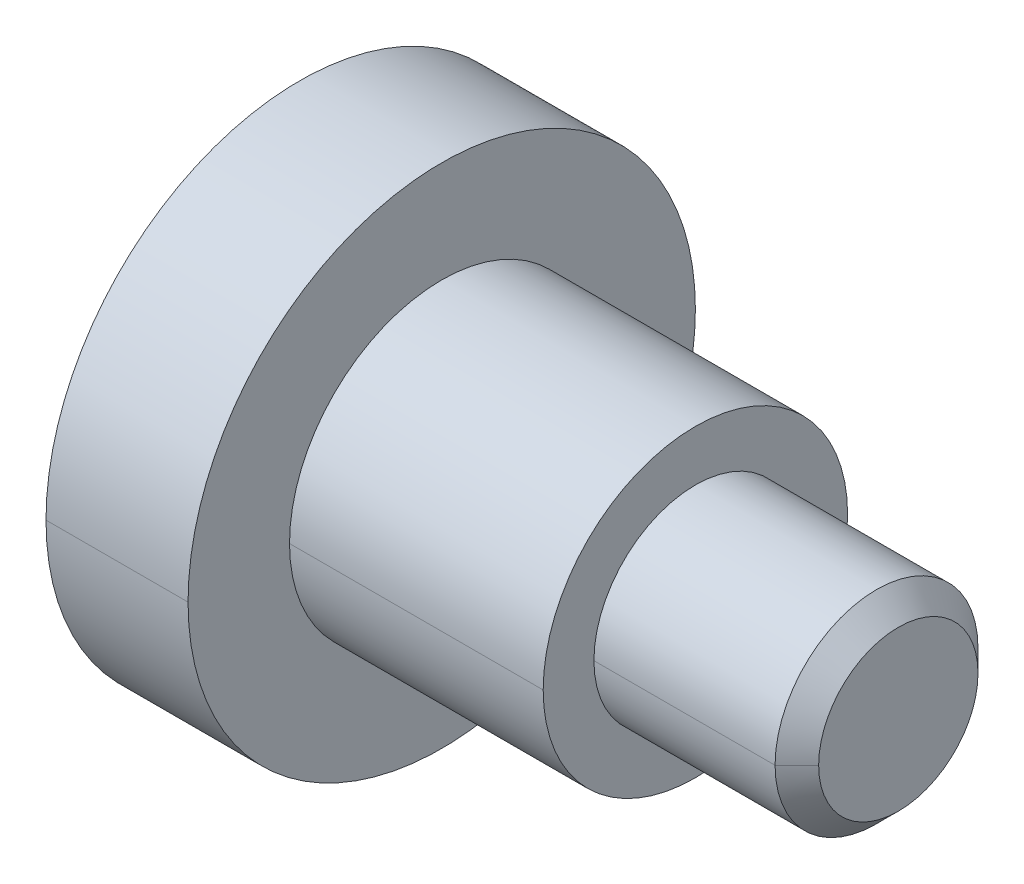
ISO-10303-21;
HEADER;
FILE_DESCRIPTION(('STEP AP214'),'2;1');
FILE_NAME('part.step','',(''),(''),'','','');
FILE_SCHEMA(('AUTOMOTIVE_DESIGN { 1 0 10303 214 1 1 1 1 }'));
ENDSEC;
DATA;
#1=APPLICATION_CONTEXT('core data for automotive mechanical design processes');
#2=APPLICATION_PROTOCOL_DEFINITION('international standard','automotive_design',2000,#1);
#3=PRODUCT_CONTEXT('',#1,'mechanical');
#4=PRODUCT('Part','Part','',(#3));
#5=PRODUCT_RELATED_PRODUCT_CATEGORY('part','',(#4));
#6=PRODUCT_DEFINITION_FORMATION('','',#4);
#7=PRODUCT_DEFINITION_CONTEXT('part definition',#1,'design');
#8=PRODUCT_DEFINITION('design','',#6,#7);
#9=PRODUCT_DEFINITION_SHAPE('','',#8);
#10=(LENGTH_UNIT() NAMED_UNIT(*) SI_UNIT(.MILLI.,.METRE.));
#11=(NAMED_UNIT(*) PLANE_ANGLE_UNIT() SI_UNIT($,.RADIAN.));
#12=(NAMED_UNIT(*) SI_UNIT($,.STERADIAN.) SOLID_ANGLE_UNIT());
#13=UNCERTAINTY_MEASURE_WITH_UNIT(LENGTH_MEASURE(1.E-05),#10,'distance_accuracy_value','');
#14=(GEOMETRIC_REPRESENTATION_CONTEXT(3) GLOBAL_UNCERTAINTY_ASSIGNED_CONTEXT((#13)) GLOBAL_UNIT_ASSIGNED_CONTEXT((#10,
#11,#12)) REPRESENTATION_CONTEXT('',''));
#15=CARTESIAN_POINT('',(0.,0.,0.));
#16=DIRECTION('',(0.,0.,1.));
#17=DIRECTION('',(1.,0.,0.));
#18=AXIS2_PLACEMENT_3D('',#15,#16,#17);
#19=CARTESIAN_POINT('',(4.,1.5705,0.));
#20=DIRECTION('',(-1.,0.,0.));
#21=DIRECTION('',(0.,0.,1.));
#22=AXIS2_PLACEMENT_3D('',#19,#20,#21);
#23=PLANE('',#22);
#24=CARTESIAN_POINT('',(4.,0.,0.));
#25=DIRECTION('',(1.,0.,0.));
#26=DIRECTION('',(0.,0.,-1.));
#27=AXIS2_PLACEMENT_3D('',#24,#25,#26);
#28=CIRCLE('',#27,1.5705);
#29=CARTESIAN_POINT('',(4.,0.,1.5705));
#30=VERTEX_POINT('',#29);
#31=CARTESIAN_POINT('',(4.,0.,-1.5705));
#32=VERTEX_POINT('',#31);
#33=EDGE_CURVE('E9',#30,#32,#28,.T.);
#34=ORIENTED_EDGE('',*,*,#33,.T.);
#35=CARTESIAN_POINT('',(4.,0.,0.));
#36=DIRECTION('',(1.,0.,0.));
#37=DIRECTION('',(0.,0.,-1.));
#38=AXIS2_PLACEMENT_3D('',#35,#36,#37);
#39=CIRCLE('',#38,1.5705);
#40=EDGE_CURVE('E175',#32,#30,#39,.T.);
#41=ORIENTED_EDGE('',*,*,#40,.T.);
#42=EDGE_LOOP('',(#34,#41));
#43=FACE_BOUND('',#42,.T.);
#44=ADVANCED_FACE('F15',(#43),#23,.F.);
#45=CARTESIAN_POINT('',(3.5705,0.,0.));
#46=DIRECTION('',(-1.,0.,0.));
#47=DIRECTION('',(0.,0.,1.));
#48=AXIS2_PLACEMENT_3D('',#45,#46,#47);
#49=CONICAL_SURFACE('',#48,2.,0.785398163397448);
#50=DIRECTION('',(-0.707106781186548,0.,-0.707106781186547));
#51=VECTOR('',#50,1.);
#52=CARTESIAN_POINT('',(3.5705,0.,-2.));
#53=LINE('',#52,#51);
#54=CARTESIAN_POINT('',(3.5705,0.,-2.));
#55=VERTEX_POINT('',#54);
#56=EDGE_CURVE('E180',#32,#55,#53,.T.);
#57=ORIENTED_EDGE('',*,*,#56,.F.);
#58=ORIENTED_EDGE('',*,*,#33,.F.);
#59=DIRECTION('',(-0.707106781186548,0.,0.707106781186547));
#60=VECTOR('',#59,1.);
#61=CARTESIAN_POINT('',(3.5705,0.,2.));
#62=LINE('',#61,#60);
#63=CARTESIAN_POINT('',(3.5705,0.,2.));
#64=VERTEX_POINT('',#63);
#65=EDGE_CURVE('E189',#30,#64,#62,.T.);
#66=ORIENTED_EDGE('',*,*,#65,.T.);
#67=CARTESIAN_POINT('',(3.5705,0.,0.));
#68=DIRECTION('',(1.,0.,0.));
#69=DIRECTION('',(0.,0.,-1.));
#70=AXIS2_PLACEMENT_3D('',#67,#68,#69);
#71=CIRCLE('',#70,2.);
#72=EDGE_CURVE('E24',#64,#55,#71,.T.);
#73=ORIENTED_EDGE('',*,*,#72,.T.);
#74=EDGE_LOOP('',(#57,#58,#66,#73));
#75=FACE_BOUND('',#74,.T.);
#76=ADVANCED_FACE('F181',(#75),#49,.T.);
#77=CARTESIAN_POINT('',(4.,0.,0.));
#78=DIRECTION('',(1.,0.,0.));
#79=DIRECTION('',(0.,0.,-1.));
#80=AXIS2_PLACEMENT_3D('',#77,#78,#79);
#81=CYLINDRICAL_SURFACE('',#80,2.);
#82=DIRECTION('',(1.,0.,0.));
#83=VECTOR('',#82,1.);
#84=CARTESIAN_POINT('',(4.,0.,2.));
#85=LINE('',#84,#83);
#86=CARTESIAN_POINT('',(0.,0.,2.));
#87=VERTEX_POINT('',#86);
#88=EDGE_CURVE('E214',#87,#64,#85,.T.);
#89=ORIENTED_EDGE('',*,*,#88,.F.);
#90=CARTESIAN_POINT('',(0.,0.,0.));
#91=DIRECTION('',(1.,0.,0.));
#92=DIRECTION('',(0.,0.,-1.));
#93=AXIS2_PLACEMENT_3D('',#90,#91,#92);
#94=CIRCLE('',#93,2.);
#95=CARTESIAN_POINT('',(0.,0.,-2.));
#96=VERTEX_POINT('',#95);
#97=EDGE_CURVE('E18',#87,#96,#94,.T.);
#98=ORIENTED_EDGE('',*,*,#97,.T.);
#99=DIRECTION('',(1.,0.,0.));
#100=VECTOR('',#99,1.);
#101=CARTESIAN_POINT('',(4.,0.,-2.));
#102=LINE('',#101,#100);
#103=EDGE_CURVE('E218',#96,#55,#102,.T.);
#104=ORIENTED_EDGE('',*,*,#103,.T.);
#105=ORIENTED_EDGE('',*,*,#72,.F.);
#106=EDGE_LOOP('',(#89,#98,#104,#105));
#107=FACE_BOUND('',#106,.T.);
#108=ADVANCED_FACE('F378',(#107),#81,.T.);
#109=CARTESIAN_POINT('',(0.,3.,0.));
#110=DIRECTION('',(-1.,0.,0.));
#111=DIRECTION('',(0.,0.,1.));
#112=AXIS2_PLACEMENT_3D('',#109,#110,#111);
#113=PLANE('',#112);
#114=CARTESIAN_POINT('',(0.,0.,0.));
#115=DIRECTION('',(1.,0.,0.));
#116=DIRECTION('',(0.,0.,-1.));
#117=AXIS2_PLACEMENT_3D('',#114,#115,#116);
#118=CIRCLE('',#117,2.);
#119=EDGE_CURVE('E219',#96,#87,#118,.T.);
#120=ORIENTED_EDGE('',*,*,#119,.F.);
#121=ORIENTED_EDGE('',*,*,#97,.F.);
#122=EDGE_LOOP('',(#120,#121));
#123=FACE_BOUND('',#122,.T.);
#124=CARTESIAN_POINT('',(0.,0.,0.));
#125=DIRECTION('',(1.,0.,0.));
#126=DIRECTION('',(0.,0.,-1.));
#127=AXIS2_PLACEMENT_3D('',#124,#125,#126);
#128=CIRCLE('',#127,3.);
#129=CARTESIAN_POINT('',(0.,0.,-3.));
#130=VERTEX_POINT('',#129);
#131=CARTESIAN_POINT('',(0.,0.,3.));
#132=VERTEX_POINT('',#131);
#133=EDGE_CURVE('E204',#130,#132,#128,.T.);
#134=ORIENTED_EDGE('',*,*,#133,.T.);
#135=CARTESIAN_POINT('',(0.,0.,0.));
#136=DIRECTION('',(1.,0.,0.));
#137=DIRECTION('',(0.,0.,-1.));
#138=AXIS2_PLACEMENT_3D('',#135,#136,#137);
#139=CIRCLE('',#138,3.);
#140=EDGE_CURVE('E367',#132,#130,#139,.T.);
#141=ORIENTED_EDGE('',*,*,#140,.T.);
#142=EDGE_LOOP('',(#134,#141));
#143=FACE_BOUND('',#142,.T.);
#144=ADVANCED_FACE('F384',(#123,#143),#113,.F.);
#145=CARTESIAN_POINT('',(4.,0.,0.));
#146=DIRECTION('',(1.,0.,0.));
#147=DIRECTION('',(0.,0.,-1.));
#148=AXIS2_PLACEMENT_3D('',#145,#146,#147);
#149=CYLINDRICAL_SURFACE('',#148,3.);
#150=DIRECTION('',(1.,0.,0.));
#151=VECTOR('',#150,1.);
#152=CARTESIAN_POINT('',(4.,0.,3.));
#153=LINE('',#152,#151);
#154=CARTESIAN_POINT('',(-5.,0.,3.));
#155=VERTEX_POINT('',#154);
#156=EDGE_CURVE('E209',#155,#132,#153,.T.);
#157=ORIENTED_EDGE('',*,*,#156,.F.);
#158=CARTESIAN_POINT('',(-5.,0.,0.));
#159=DIRECTION('',(1.,0.,0.));
#160=DIRECTION('',(0.,0.,-1.));
#161=AXIS2_PLACEMENT_3D('',#158,#159,#160);
#162=CIRCLE('',#161,3.);
#163=CARTESIAN_POINT('',(-5.,0.,-3.));
#164=VERTEX_POINT('',#163);
#165=EDGE_CURVE('E365',#155,#164,#162,.T.);
#166=ORIENTED_EDGE('',*,*,#165,.T.);
#167=DIRECTION('',(1.,0.,0.));
#168=VECTOR('',#167,1.);
#169=CARTESIAN_POINT('',(4.,0.,-3.));
#170=LINE('',#169,#168);
#171=EDGE_CURVE('E208',#164,#130,#170,.T.);
#172=ORIENTED_EDGE('',*,*,#171,.T.);
#173=ORIENTED_EDGE('',*,*,#140,.F.);
#174=EDGE_LOOP('',(#157,#166,#172,#173));
#175=FACE_BOUND('',#174,.T.);
#176=ADVANCED_FACE('F386',(#175),#149,.T.);
#177=CARTESIAN_POINT('',(-5.,5.,0.));
#178=DIRECTION('',(-1.,0.,0.));
#179=DIRECTION('',(0.,0.,1.));
#180=AXIS2_PLACEMENT_3D('',#177,#178,#179);
#181=PLANE('',#180);
#182=CARTESIAN_POINT('',(-5.,0.,0.));
#183=DIRECTION('',(1.,0.,0.));
#184=DIRECTION('',(0.,0.,-1.));
#185=AXIS2_PLACEMENT_3D('',#182,#183,#184);
#186=CIRCLE('',#185,3.);
#187=EDGE_CURVE('E213',#164,#155,#186,.T.);
#188=ORIENTED_EDGE('',*,*,#187,.F.);
#189=ORIENTED_EDGE('',*,*,#165,.F.);
#190=EDGE_LOOP('',(#188,#189));
#191=FACE_BOUND('',#190,.T.);
#192=CARTESIAN_POINT('',(-5.,0.,0.));
#193=DIRECTION('',(1.,0.,0.));
#194=DIRECTION('',(0.,0.,-1.));
#195=AXIS2_PLACEMENT_3D('',#192,#193,#194);
#196=CIRCLE('',#195,5.);
#197=CARTESIAN_POINT('',(-5.,0.,-5.));
#198=VERTEX_POINT('',#197);
#199=CARTESIAN_POINT('',(-5.,0.,5.));
#200=VERTEX_POINT('',#199);
#201=EDGE_CURVE('E202',#198,#200,#196,.T.);
#202=ORIENTED_EDGE('',*,*,#201,.T.);
#203=CARTESIAN_POINT('',(-5.,0.,0.));
#204=DIRECTION('',(1.,0.,0.));
#205=DIRECTION('',(0.,0.,-1.));
#206=AXIS2_PLACEMENT_3D('',#203,#204,#205);
#207=CIRCLE('',#206,5.);
#208=EDGE_CURVE('E360',#200,#198,#207,.T.);
#209=ORIENTED_EDGE('',*,*,#208,.T.);
#210=EDGE_LOOP('',(#202,#209));
#211=FACE_BOUND('',#210,.T.);
#212=ADVANCED_FACE('F396',(#191,#211),#181,.F.);
#213=CARTESIAN_POINT('',(-5.3,0.72168783648703,1.25));
#214=DIRECTION('',(0.,0.866025403784427,0.50000000000002));
#215=DIRECTION('',(1.,0.,0.));
#216=AXIS2_PLACEMENT_3D('',#213,#214,#215);
#217=PLANE('',#216);
#218=DIRECTION('',(0.,0.50000000000002,-0.866025403784427));
#219=VECTOR('',#218,1.);
#220=CARTESIAN_POINT('',(-7.8,0.72168783648703,1.25));
#221=LINE('',#220,#219);
#222=CARTESIAN_POINT('',(-7.8,0.72168783648703,1.25));
#223=VERTEX_POINT('',#222);
#224=CARTESIAN_POINT('',(-7.8,1.4433756729741,0.));
#225=VERTEX_POINT('',#224);
#226=EDGE_CURVE('E305',#223,#225,#221,.T.);
#227=ORIENTED_EDGE('',*,*,#226,.T.);
#228=DIRECTION('',(-1.,0.,0.));
#229=VECTOR('',#228,1.);
#230=CARTESIAN_POINT('',(-5.3,1.4433756729741,0.));
#231=LINE('',#230,#229);
#232=CARTESIAN_POINT('',(-5.3,1.4433756729741,0.));
#233=VERTEX_POINT('',#232);
#234=EDGE_CURVE('E49',#233,#225,#231,.T.);
#235=ORIENTED_EDGE('',*,*,#234,.F.);
#236=DIRECTION('',(0.,0.50000000000002,-0.866025403784427));
#237=VECTOR('',#236,1.);
#238=CARTESIAN_POINT('',(-5.3,1.08253175473055,0.625000000000031));
#239=LINE('',#238,#237);
#240=CARTESIAN_POINT('',(-5.3,1.08253175473053,0.625000000000024));
#241=VERTEX_POINT('',#240);
#242=EDGE_CURVE('E261',#241,#233,#239,.T.);
#243=ORIENTED_EDGE('',*,*,#242,.F.);
#244=DIRECTION('',(0.,0.50000000000002,-0.866025403784427));
#245=VECTOR('',#244,1.);
#246=CARTESIAN_POINT('',(-5.3,0.72168783648703,1.25));
#247=LINE('',#246,#245);
#248=CARTESIAN_POINT('',(-5.3,0.72168783648703,1.25));
#249=VERTEX_POINT('',#248);
#250=EDGE_CURVE('E244',#249,#241,#247,.T.);
#251=ORIENTED_EDGE('',*,*,#250,.F.);
#252=DIRECTION('',(-1.,0.,0.));
#253=VECTOR('',#252,1.);
#254=CARTESIAN_POINT('',(-5.3,0.72168783648703,1.25));
#255=LINE('',#254,#253);
#256=EDGE_CURVE('E346',#249,#223,#255,.T.);
#257=ORIENTED_EDGE('',*,*,#256,.T.);
#258=EDGE_LOOP('',(#227,#235,#243,#251,#257));
#259=FACE_BOUND('',#258,.T.);
#260=ADVANCED_FACE('F399',(#259),#217,.F.);
#261=CARTESIAN_POINT('',(-5.3,1.4433756729741,0.));
#262=DIRECTION('',(0.,0.866025403784427,-0.50000000000002));
#263=DIRECTION('',(-1.,0.,0.));
#264=AXIS2_PLACEMENT_3D('',#261,#262,#263);
#265=PLANE('',#264);
#266=DIRECTION('',(0.,-0.50000000000002,-0.866025403784427));
#267=VECTOR('',#266,1.);
#268=CARTESIAN_POINT('',(-7.8,1.4433756729741,0.));
#269=LINE('',#268,#267);
#270=CARTESIAN_POINT('',(-7.8,0.72168783648703,-1.25));
#271=VERTEX_POINT('',#270);
#272=EDGE_CURVE('E302',#225,#271,#269,.T.);
#273=ORIENTED_EDGE('',*,*,#272,.T.);
#274=DIRECTION('',(-1.,0.,0.));
#275=VECTOR('',#274,1.);
#276=CARTESIAN_POINT('',(-5.3,0.72168783648703,-1.25));
#277=LINE('',#276,#275);
#278=CARTESIAN_POINT('',(-5.3,0.72168783648703,-1.25));
#279=VERTEX_POINT('',#278);
#280=EDGE_CURVE('E38',#279,#271,#277,.T.);
#281=ORIENTED_EDGE('',*,*,#280,.F.);
#282=DIRECTION('',(0.,-0.50000000000002,-0.866025403784427));
#283=VECTOR('',#282,1.);
#284=CARTESIAN_POINT('',(-5.3,1.08253175473055,-0.625000000000031));
#285=LINE('',#284,#283);
#286=CARTESIAN_POINT('',(-5.3,1.08253175473053,-0.625000000000024));
#287=VERTEX_POINT('',#286);
#288=EDGE_CURVE('E225',#287,#279,#285,.T.);
#289=ORIENTED_EDGE('',*,*,#288,.F.);
#290=DIRECTION('',(0.,-0.50000000000002,-0.866025403784427));
#291=VECTOR('',#290,1.);
#292=CARTESIAN_POINT('',(-5.3,1.4433756729741,0.));
#293=LINE('',#292,#291);
#294=EDGE_CURVE('E248',#233,#287,#293,.T.);
#295=ORIENTED_EDGE('',*,*,#294,.F.);
#296=ORIENTED_EDGE('',*,*,#234,.T.);
#297=EDGE_LOOP('',(#273,#281,#289,#295,#296));
#298=FACE_BOUND('',#297,.T.);
#299=ADVANCED_FACE('F442',(#298),#265,.F.);
#300=CARTESIAN_POINT('',(4.,0.,0.));
#301=DIRECTION('',(1.,0.,0.));
#302=DIRECTION('',(0.,0.,-1.));
#303=AXIS2_PLACEMENT_3D('',#300,#301,#302);
#304=CYLINDRICAL_SURFACE('',#303,5.);
#305=DIRECTION('',(1.,0.,0.));
#306=VECTOR('',#305,1.);
#307=CARTESIAN_POINT('',(4.,0.,5.));
#308=LINE('',#307,#306);
#309=CARTESIAN_POINT('',(-7.8,0.,5.));
#310=VERTEX_POINT('',#309);
#311=EDGE_CURVE('E198',#310,#200,#308,.T.);
#312=ORIENTED_EDGE('',*,*,#311,.F.);
#313=CARTESIAN_POINT('',(-7.8,0.,0.));
#314=DIRECTION('',(1.,0.,0.));
#315=DIRECTION('',(0.,0.,-1.));
#316=AXIS2_PLACEMENT_3D('',#313,#314,#315);
#317=CIRCLE('',#316,5.);
#318=CARTESIAN_POINT('',(-7.8,0.,-5.));
#319=VERTEX_POINT('',#318);
#320=EDGE_CURVE('E335',#310,#319,#317,.T.);
#321=ORIENTED_EDGE('',*,*,#320,.T.);
#322=DIRECTION('',(1.,0.,0.));
#323=VECTOR('',#322,1.);
#324=CARTESIAN_POINT('',(4.,0.,-5.));
#325=LINE('',#324,#323);
#326=EDGE_CURVE('E253',#319,#198,#325,.T.);
#327=ORIENTED_EDGE('',*,*,#326,.T.);
#328=ORIENTED_EDGE('',*,*,#208,.F.);
#329=EDGE_LOOP('',(#312,#321,#327,#328));
#330=FACE_BOUND('',#329,.T.);
#331=ADVANCED_FACE('F408',(#330),#304,.T.);
#332=CARTESIAN_POINT('',(-5.3,0.72168783648703,-1.25));
#333=DIRECTION('',(0.,0.,-1.));
#334=DIRECTION('',(0.,-1.,0.));
#335=AXIS2_PLACEMENT_3D('',#332,#333,#334);
#336=PLANE('',#335);
#337=DIRECTION('',(0.,-1.,0.));
#338=VECTOR('',#337,1.);
#339=CARTESIAN_POINT('',(-7.8,0.72168783648703,-1.25));
#340=LINE('',#339,#338);
#341=CARTESIAN_POINT('',(-7.8,-0.72168783648703,-1.25));
#342=VERTEX_POINT('',#341);
#343=EDGE_CURVE('E306',#271,#342,#340,.T.);
#344=ORIENTED_EDGE('',*,*,#343,.T.);
#345=DIRECTION('',(-1.,0.,0.));
#346=VECTOR('',#345,1.);
#347=CARTESIAN_POINT('',(-5.3,-0.72168783648703,-1.25));
#348=LINE('',#347,#346);
#349=CARTESIAN_POINT('',(-5.3,-0.72168783648703,-1.25));
#350=VERTEX_POINT('',#349);
#351=EDGE_CURVE('E331',#350,#342,#348,.T.);
#352=ORIENTED_EDGE('',*,*,#351,.F.);
#353=DIRECTION('',(0.,-1.,0.));
#354=VECTOR('',#353,1.);
#355=CARTESIAN_POINT('',(-5.3,0.,-1.25));
#356=LINE('',#355,#354);
#357=CARTESIAN_POINT('',(-5.3,0.,-1.25));
#358=VERTEX_POINT('',#357);
#359=EDGE_CURVE('E222',#358,#350,#356,.T.);
#360=ORIENTED_EDGE('',*,*,#359,.F.);
#361=DIRECTION('',(0.,-1.,0.));
#362=VECTOR('',#361,1.);
#363=CARTESIAN_POINT('',(-5.3,0.72168783648703,-1.25));
#364=LINE('',#363,#362);
#365=EDGE_CURVE('E257',#279,#358,#364,.T.);
#366=ORIENTED_EDGE('',*,*,#365,.F.);
#367=ORIENTED_EDGE('',*,*,#280,.T.);
#368=EDGE_LOOP('',(#344,#352,#360,#366,#367));
#369=FACE_BOUND('',#368,.T.);
#370=ADVANCED_FACE('F445',(#369),#336,.F.);
#371=CARTESIAN_POINT('',(-5.3,0.,0.));
#372=DIRECTION('',(-1.,0.,0.));
#373=DIRECTION('',(0.,0.,1.));
#374=AXIS2_PLACEMENT_3D('',#371,#372,#373);
#375=PLANE('',#374);
#376=DIRECTION('',(0.,-0.50000000000002,0.866025403784427));
#377=VECTOR('',#376,1.);
#378=CARTESIAN_POINT('',(-5.3,-0.72168783648703,-1.25));
#379=LINE('',#378,#377);
#380=CARTESIAN_POINT('',(-5.3,-1.08253175473053,-0.625000000000024));
#381=VERTEX_POINT('',#380);
#382=EDGE_CURVE('E231',#350,#381,#379,.T.);
#383=ORIENTED_EDGE('',*,*,#382,.T.);
#384=CARTESIAN_POINT('',(-5.3,0.,0.));
#385=DIRECTION('',(1.,0.,0.));
#386=DIRECTION('',(0.,-0.866025403784428,-0.500000000000019));
#387=AXIS2_PLACEMENT_3D('',#384,#385,#386);
#388=CIRCLE('',#387,1.25);
#389=EDGE_CURVE('E277',#381,#358,#388,.T.);
#390=ORIENTED_EDGE('',*,*,#389,.T.);
#391=ORIENTED_EDGE('',*,*,#359,.T.);
#392=EDGE_LOOP('',(#383,#390,#391));
#393=FACE_BOUND('',#392,.T.);
#394=ADVANCED_FACE('F448',(#393),#375,.T.);
#395=CARTESIAN_POINT('',(-5.3,0.,0.));
#396=DIRECTION('',(-1.,0.,0.));
#397=DIRECTION('',(0.,0.,1.));
#398=AXIS2_PLACEMENT_3D('',#395,#396,#397);
#399=PLANE('',#398);
#400=ORIENTED_EDGE('',*,*,#365,.T.);
#401=CARTESIAN_POINT('',(-5.3,0.,0.));
#402=DIRECTION('',(1.,0.,0.));
#403=DIRECTION('',(0.,0.,-1.));
#404=AXIS2_PLACEMENT_3D('',#401,#402,#403);
#405=CIRCLE('',#404,1.25);
#406=EDGE_CURVE('E232',#358,#287,#405,.T.);
#407=ORIENTED_EDGE('',*,*,#406,.T.);
#408=ORIENTED_EDGE('',*,*,#288,.T.);
#409=EDGE_LOOP('',(#400,#407,#408));
#410=FACE_BOUND('',#409,.T.);
#411=ADVANCED_FACE('F450',(#410),#399,.T.);
#412=CARTESIAN_POINT('',(-5.3,0.,0.));
#413=DIRECTION('',(-1.,0.,0.));
#414=DIRECTION('',(0.,0.,1.));
#415=AXIS2_PLACEMENT_3D('',#412,#413,#414);
#416=PLANE('',#415);
#417=ORIENTED_EDGE('',*,*,#294,.T.);
#418=CARTESIAN_POINT('',(-5.3,0.,0.));
#419=DIRECTION('',(1.,0.,0.));
#420=DIRECTION('',(0.,0.866025403784427,-0.50000000000002));
#421=AXIS2_PLACEMENT_3D('',#418,#419,#420);
#422=CIRCLE('',#421,1.25);
#423=EDGE_CURVE('E322',#287,#241,#422,.T.);
#424=ORIENTED_EDGE('',*,*,#423,.T.);
#425=ORIENTED_EDGE('',*,*,#242,.T.);
#426=EDGE_LOOP('',(#417,#424,#425));
#427=FACE_BOUND('',#426,.T.);
#428=ADVANCED_FACE('F452',(#427),#416,.T.);
#429=CARTESIAN_POINT('',(-5.3,0.,0.));
#430=DIRECTION('',(-1.,0.,0.));
#431=DIRECTION('',(0.,0.,1.));
#432=AXIS2_PLACEMENT_3D('',#429,#430,#431);
#433=PLANE('',#432);
#434=ORIENTED_EDGE('',*,*,#250,.T.);
#435=CARTESIAN_POINT('',(-5.3,0.,0.));
#436=DIRECTION('',(1.,0.,0.));
#437=DIRECTION('',(0.,0.866025403784428,0.500000000000019));
#438=AXIS2_PLACEMENT_3D('',#435,#436,#437);
#439=CIRCLE('',#438,1.25);
#440=CARTESIAN_POINT('',(-5.3,0.,1.25));
#441=VERTEX_POINT('',#440);
#442=EDGE_CURVE('E318',#241,#441,#439,.T.);
#443=ORIENTED_EDGE('',*,*,#442,.T.);
#444=DIRECTION('',(0.,1.,0.));
#445=VECTOR('',#444,1.);
#446=CARTESIAN_POINT('',(-5.3,0.,1.25));
#447=LINE('',#446,#445);
#448=EDGE_CURVE('E349',#441,#249,#447,.T.);
#449=ORIENTED_EDGE('',*,*,#448,.T.);
#450=EDGE_LOOP('',(#434,#443,#449));
#451=FACE_BOUND('',#450,.T.);
#452=ADVANCED_FACE('F457',(#451),#433,.T.);
#453=CARTESIAN_POINT('',(-5.3,0.,0.));
#454=DIRECTION('',(-1.,0.,0.));
#455=DIRECTION('',(0.,0.,1.));
#456=AXIS2_PLACEMENT_3D('',#453,#454,#455);
#457=PLANE('',#456);
#458=DIRECTION('',(0.,1.,0.));
#459=VECTOR('',#458,1.);
#460=CARTESIAN_POINT('',(-5.3,-0.72168783648703,1.25));
#461=LINE('',#460,#459);
#462=CARTESIAN_POINT('',(-5.3,-0.72168783648703,1.25));
#463=VERTEX_POINT('',#462);
#464=EDGE_CURVE('E249',#463,#441,#461,.T.);
#465=ORIENTED_EDGE('',*,*,#464,.T.);
#466=CARTESIAN_POINT('',(-5.3,0.,0.));
#467=DIRECTION('',(1.,0.,0.));
#468=DIRECTION('',(0.,0.,1.));
#469=AXIS2_PLACEMENT_3D('',#466,#467,#468);
#470=CIRCLE('',#469,1.25);
#471=CARTESIAN_POINT('',(-5.3,-1.08253175473053,0.625000000000024));
#472=VERTEX_POINT('',#471);
#473=EDGE_CURVE('E285',#441,#472,#470,.T.);
#474=ORIENTED_EDGE('',*,*,#473,.T.);
#475=DIRECTION('',(0.,0.50000000000002,0.866025403784427));
#476=VECTOR('',#475,1.);
#477=CARTESIAN_POINT('',(-5.3,-1.08253175473055,0.625000000000031));
#478=LINE('',#477,#476);
#479=EDGE_CURVE('E310',#472,#463,#478,.T.);
#480=ORIENTED_EDGE('',*,*,#479,.T.);
#481=EDGE_LOOP('',(#465,#474,#480));
#482=FACE_BOUND('',#481,.T.);
#483=ADVANCED_FACE('F424',(#482),#457,.T.);
#484=CARTESIAN_POINT('',(-5.3,-0.72168783648703,1.25));
#485=DIRECTION('',(0.,0.,1.));
#486=DIRECTION('',(1.,0.,0.));
#487=AXIS2_PLACEMENT_3D('',#484,#485,#486);
#488=PLANE('',#487);
#489=DIRECTION('',(0.,1.,0.));
#490=VECTOR('',#489,1.);
#491=CARTESIAN_POINT('',(-7.8,-0.72168783648703,1.25));
#492=LINE('',#491,#490);
#493=CARTESIAN_POINT('',(-7.8,-0.72168783648703,1.25));
#494=VERTEX_POINT('',#493);
#495=EDGE_CURVE('E342',#494,#223,#492,.T.);
#496=ORIENTED_EDGE('',*,*,#495,.T.);
#497=ORIENTED_EDGE('',*,*,#256,.F.);
#498=ORIENTED_EDGE('',*,*,#448,.F.);
#499=ORIENTED_EDGE('',*,*,#464,.F.);
#500=DIRECTION('',(-1.,0.,0.));
#501=VECTOR('',#500,1.);
#502=CARTESIAN_POINT('',(-5.3,-0.72168783648703,1.25));
#503=LINE('',#502,#501);
#504=EDGE_CURVE('E301',#463,#494,#503,.T.);
#505=ORIENTED_EDGE('',*,*,#504,.T.);
#506=EDGE_LOOP('',(#496,#497,#498,#499,#505));
#507=FACE_BOUND('',#506,.T.);
#508=ADVANCED_FACE('F413',(#507),#488,.F.);
#509=CARTESIAN_POINT('',(-7.8,0.,0.));
#510=DIRECTION('',(1.,0.,0.));
#511=DIRECTION('',(0.,1.,0.));
#512=AXIS2_PLACEMENT_3D('',#509,#510,#511);
#513=PLANE('',#512);
#514=DIRECTION('',(0.,0.50000000000002,0.866025403784427));
#515=VECTOR('',#514,1.);
#516=CARTESIAN_POINT('',(-7.8,-1.4433756729741,0.));
#517=LINE('',#516,#515);
#518=CARTESIAN_POINT('',(-7.8,-1.4433756729741,0.));
#519=VERTEX_POINT('',#518);
#520=EDGE_CURVE('E297',#519,#494,#517,.T.);
#521=ORIENTED_EDGE('',*,*,#520,.F.);
#522=DIRECTION('',(0.,-0.50000000000002,0.866025403784427));
#523=VECTOR('',#522,1.);
#524=CARTESIAN_POINT('',(-7.8,-0.72168783648703,-1.25));
#525=LINE('',#524,#523);
#526=EDGE_CURVE('E228',#342,#519,#525,.T.);
#527=ORIENTED_EDGE('',*,*,#526,.F.);
#528=ORIENTED_EDGE('',*,*,#343,.F.);
#529=ORIENTED_EDGE('',*,*,#272,.F.);
#530=ORIENTED_EDGE('',*,*,#226,.F.);
#531=ORIENTED_EDGE('',*,*,#495,.F.);
#532=EDGE_LOOP('',(#521,#527,#528,#529,#530,#531));
#533=FACE_BOUND('',#532,.T.);
#534=CARTESIAN_POINT('',(-7.8,0.,0.));
#535=DIRECTION('',(1.,0.,0.));
#536=DIRECTION('',(0.,0.,-1.));
#537=AXIS2_PLACEMENT_3D('',#534,#535,#536);
#538=CIRCLE('',#537,5.);
#539=EDGE_CURVE('E203',#319,#310,#538,.T.);
#540=ORIENTED_EDGE('',*,*,#539,.F.);
#541=ORIENTED_EDGE('',*,*,#320,.F.);
#542=EDGE_LOOP('',(#540,#541));
#543=FACE_BOUND('',#542,.T.);
#544=ADVANCED_FACE('F410',(#533,#543),#513,.F.);
#545=CARTESIAN_POINT('',(-5.3,-0.72168783648703,-1.25));
#546=DIRECTION('',(0.,-0.866025403784427,-0.50000000000002));
#547=DIRECTION('',(0.,0.50000000000002,-0.866025403784427));
#548=AXIS2_PLACEMENT_3D('',#545,#546,#547);
#549=PLANE('',#548);
#550=ORIENTED_EDGE('',*,*,#526,.T.);
#551=DIRECTION('',(-1.,0.,0.));
#552=VECTOR('',#551,1.);
#553=CARTESIAN_POINT('',(-5.3,-1.4433756729741,0.));
#554=LINE('',#553,#552);
#555=CARTESIAN_POINT('',(-5.3,-1.4433756729741,0.));
#556=VERTEX_POINT('',#555);
#557=EDGE_CURVE('E314',#556,#519,#554,.T.);
#558=ORIENTED_EDGE('',*,*,#557,.F.);
#559=DIRECTION('',(0.,-0.50000000000002,0.866025403784427));
#560=VECTOR('',#559,1.);
#561=CARTESIAN_POINT('',(-5.3,-1.08253175473055,-0.625000000000031));
#562=LINE('',#561,#560);
#563=EDGE_CURVE('E293',#381,#556,#562,.T.);
#564=ORIENTED_EDGE('',*,*,#563,.F.);
#565=ORIENTED_EDGE('',*,*,#382,.F.);
#566=ORIENTED_EDGE('',*,*,#351,.T.);
#567=EDGE_LOOP('',(#550,#558,#564,#565,#566));
#568=FACE_BOUND('',#567,.T.);
#569=ADVANCED_FACE('F412',(#568),#549,.F.);
#570=CARTESIAN_POINT('',(-5.3,0.,0.));
#571=DIRECTION('',(-1.,0.,0.));
#572=DIRECTION('',(0.,0.,1.));
#573=AXIS2_PLACEMENT_3D('',#570,#571,#572);
#574=CONICAL_SURFACE('',#573,1.25,1.04719755119662);
#575=DIRECTION('',(-0.499999999999983,0.,-0.866025403784449));
#576=VECTOR('',#575,1.);
#577=CARTESIAN_POINT('',(-5.3,0.,-1.25));
#578=LINE('',#577,#576);
#579=CARTESIAN_POINT('',(-4.578312163513,0.,0.));
#580=VERTEX_POINT('',#579);
#581=EDGE_CURVE('E271',#580,#358,#578,.T.);
#582=ORIENTED_EDGE('',*,*,#581,.F.);
#583=DIRECTION('',(-0.499999999999983,0.,0.866025403784449));
#584=VECTOR('',#583,1.);
#585=CARTESIAN_POINT('',(-5.3,0.,1.25));
#586=LINE('',#585,#584);
#587=EDGE_CURVE('E265',#580,#441,#586,.T.);
#588=ORIENTED_EDGE('',*,*,#587,.T.);
#589=ORIENTED_EDGE('',*,*,#442,.F.);
#590=ORIENTED_EDGE('',*,*,#423,.F.);
#591=ORIENTED_EDGE('',*,*,#406,.F.);
#592=EDGE_LOOP('',(#582,#588,#589,#590,#591));
#593=FACE_BOUND('',#592,.T.);
#594=ADVANCED_FACE('F421',(#593),#574,.F.);
#595=CARTESIAN_POINT('',(-5.3,-1.4433756729741,0.));
#596=DIRECTION('',(0.,-0.866025403784427,0.50000000000002));
#597=DIRECTION('',(-1.,0.,0.));
#598=AXIS2_PLACEMENT_3D('',#595,#596,#597);
#599=PLANE('',#598);
#600=ORIENTED_EDGE('',*,*,#520,.T.);
#601=ORIENTED_EDGE('',*,*,#504,.F.);
#602=ORIENTED_EDGE('',*,*,#479,.F.);
#603=DIRECTION('',(0.,0.50000000000002,0.866025403784427));
#604=VECTOR('',#603,1.);
#605=CARTESIAN_POINT('',(-5.3,-1.4433756729741,0.));
#606=LINE('',#605,#604);
#607=EDGE_CURVE('E289',#556,#472,#606,.T.);
#608=ORIENTED_EDGE('',*,*,#607,.F.);
#609=ORIENTED_EDGE('',*,*,#557,.T.);
#610=EDGE_LOOP('',(#600,#601,#602,#608,#609));
#611=FACE_BOUND('',#610,.T.);
#612=ADVANCED_FACE('F463',(#611),#599,.F.);
#613=CARTESIAN_POINT('',(-5.3,0.,0.));
#614=DIRECTION('',(-1.,0.,0.));
#615=DIRECTION('',(0.,0.,1.));
#616=AXIS2_PLACEMENT_3D('',#613,#614,#615);
#617=PLANE('',#616);
#618=ORIENTED_EDGE('',*,*,#607,.T.);
#619=CARTESIAN_POINT('',(-5.3,0.,0.));
#620=DIRECTION('',(1.,0.,0.));
#621=DIRECTION('',(0.,-0.866025403784428,0.500000000000019));
#622=AXIS2_PLACEMENT_3D('',#619,#620,#621);
#623=CIRCLE('',#622,1.25);
#624=EDGE_CURVE('E281',#472,#381,#623,.T.);
#625=ORIENTED_EDGE('',*,*,#624,.T.);
#626=ORIENTED_EDGE('',*,*,#563,.T.);
#627=EDGE_LOOP('',(#618,#625,#626));
#628=FACE_BOUND('',#627,.T.);
#629=ADVANCED_FACE('F470',(#628),#617,.T.);
#630=CARTESIAN_POINT('',(-5.3,0.,0.));
#631=DIRECTION('',(-1.,0.,0.));
#632=DIRECTION('',(0.,0.,1.));
#633=AXIS2_PLACEMENT_3D('',#630,#631,#632);
#634=CONICAL_SURFACE('',#633,1.25,1.04719755119662);
#635=ORIENTED_EDGE('',*,*,#587,.F.);
#636=ORIENTED_EDGE('',*,*,#581,.T.);
#637=ORIENTED_EDGE('',*,*,#389,.F.);
#638=ORIENTED_EDGE('',*,*,#624,.F.);
#639=ORIENTED_EDGE('',*,*,#473,.F.);
#640=EDGE_LOOP('',(#635,#636,#637,#638,#639));
#641=FACE_BOUND('',#640,.T.);
#642=ADVANCED_FACE('F477',(#641),#634,.F.);
#643=CARTESIAN_POINT('',(4.,0.,0.));
#644=DIRECTION('',(1.,0.,0.));
#645=DIRECTION('',(0.,0.,-1.));
#646=AXIS2_PLACEMENT_3D('',#643,#644,#645);
#647=CYLINDRICAL_SURFACE('',#646,5.);
#648=ORIENTED_EDGE('',*,*,#539,.T.);
#649=ORIENTED_EDGE('',*,*,#311,.T.);
#650=ORIENTED_EDGE('',*,*,#201,.F.);
#651=ORIENTED_EDGE('',*,*,#326,.F.);
#652=EDGE_LOOP('',(#648,#649,#650,#651));
#653=FACE_BOUND('',#652,.T.);
#654=ADVANCED_FACE('F405',(#653),#647,.T.);
#655=CARTESIAN_POINT('',(4.,0.,0.));
#656=DIRECTION('',(1.,0.,0.));
#657=DIRECTION('',(0.,0.,-1.));
#658=AXIS2_PLACEMENT_3D('',#655,#656,#657);
#659=CYLINDRICAL_SURFACE('',#658,3.);
#660=ORIENTED_EDGE('',*,*,#187,.T.);
#661=ORIENTED_EDGE('',*,*,#156,.T.);
#662=ORIENTED_EDGE('',*,*,#133,.F.);
#663=ORIENTED_EDGE('',*,*,#171,.F.);
#664=EDGE_LOOP('',(#660,#661,#662,#663));
#665=FACE_BOUND('',#664,.T.);
#666=ADVANCED_FACE('F392',(#665),#659,.T.);
#667=CARTESIAN_POINT('',(4.,0.,0.));
#668=DIRECTION('',(1.,0.,0.));
#669=DIRECTION('',(0.,0.,-1.));
#670=AXIS2_PLACEMENT_3D('',#667,#668,#669);
#671=CYLINDRICAL_SURFACE('',#670,2.);
#672=ORIENTED_EDGE('',*,*,#119,.T.);
#673=ORIENTED_EDGE('',*,*,#88,.T.);
#674=CARTESIAN_POINT('',(3.5705,0.,0.));
#675=DIRECTION('',(1.,0.,0.));
#676=DIRECTION('',(0.,0.,-1.));
#677=AXIS2_PLACEMENT_3D('',#674,#675,#676);
#678=CIRCLE('',#677,2.);
#679=EDGE_CURVE('E186',#55,#64,#678,.T.);
#680=ORIENTED_EDGE('',*,*,#679,.F.);
#681=ORIENTED_EDGE('',*,*,#103,.F.);
#682=EDGE_LOOP('',(#672,#673,#680,#681));
#683=FACE_BOUND('',#682,.T.);
#684=ADVANCED_FACE('F383',(#683),#671,.T.);
#685=CARTESIAN_POINT('',(3.5705,0.,0.));
#686=DIRECTION('',(-1.,0.,0.));
#687=DIRECTION('',(0.,0.,1.));
#688=AXIS2_PLACEMENT_3D('',#685,#686,#687);
#689=CONICAL_SURFACE('',#688,2.,0.785398163397448);
#690=ORIENTED_EDGE('',*,*,#40,.F.);
#691=ORIENTED_EDGE('',*,*,#56,.T.);
#692=ORIENTED_EDGE('',*,*,#679,.T.);
#693=ORIENTED_EDGE('',*,*,#65,.F.);
#694=EDGE_LOOP('',(#690,#691,#692,#693));
#695=FACE_BOUND('',#694,.T.);
#696=ADVANCED_FACE('F188',(#695),#689,.T.);
#697=CLOSED_SHELL('',(#44,#76,#108,#144,#176,#212,#260,#299,#331,#370,#394,#411,#428,#452,#483,
#508,#544,#569,#594,#612,#629,#642,#654,#666,#684,#696));
#698=MANIFOLD_SOLID_BREP('B1',#697);
#699=ADVANCED_BREP_SHAPE_REPRESENTATION('',(#18,#698),#14);
#700=SHAPE_DEFINITION_REPRESENTATION(#9,#699);
ENDSEC;
END-ISO-10303-21;
